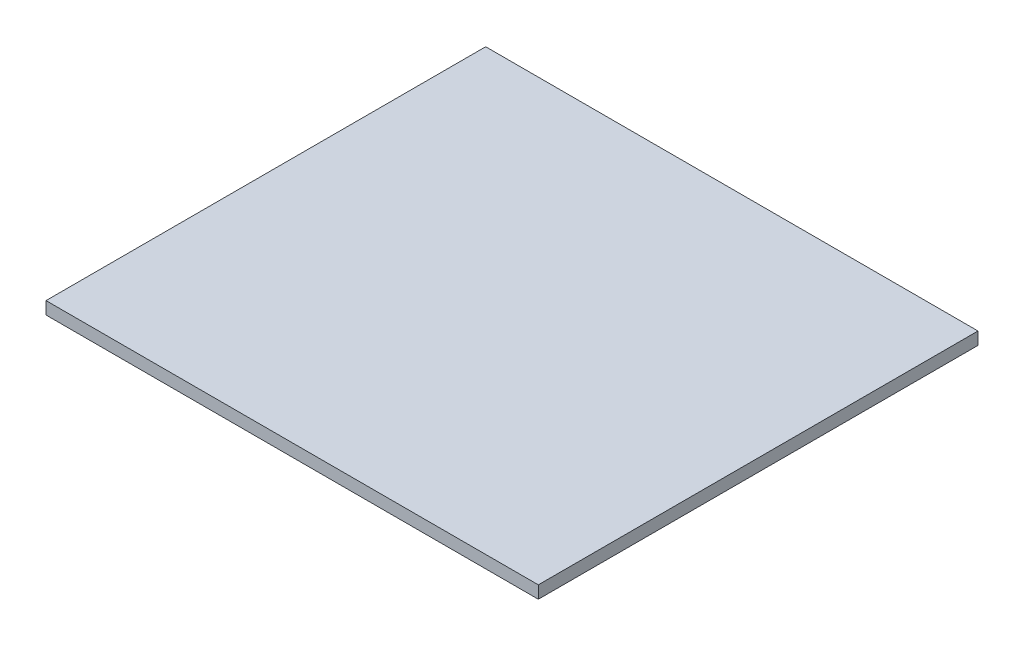
ISO-10303-21;
HEADER;
FILE_DESCRIPTION(('STEP AP214'),'2;1');
FILE_NAME('part.step','',(''),(''),'','','');
FILE_SCHEMA(('AUTOMOTIVE_DESIGN { 1 0 10303 214 1 1 1 1 }'));
ENDSEC;
DATA;
#1=APPLICATION_CONTEXT('core data for automotive mechanical design processes');
#2=APPLICATION_PROTOCOL_DEFINITION('international standard','automotive_design',2000,#1);
#3=PRODUCT_CONTEXT('',#1,'mechanical');
#4=PRODUCT('Part','Part','',(#3));
#5=PRODUCT_RELATED_PRODUCT_CATEGORY('part','',(#4));
#6=PRODUCT_DEFINITION_FORMATION('','',#4);
#7=PRODUCT_DEFINITION_CONTEXT('part definition',#1,'design');
#8=PRODUCT_DEFINITION('design','',#6,#7);
#9=PRODUCT_DEFINITION_SHAPE('','',#8);
#10=(LENGTH_UNIT() NAMED_UNIT(*) SI_UNIT(.MILLI.,.METRE.));
#11=(NAMED_UNIT(*) PLANE_ANGLE_UNIT() SI_UNIT($,.RADIAN.));
#12=(NAMED_UNIT(*) SI_UNIT($,.STERADIAN.) SOLID_ANGLE_UNIT());
#13=UNCERTAINTY_MEASURE_WITH_UNIT(LENGTH_MEASURE(1.E-05),#10,'distance_accuracy_value','');
#14=(GEOMETRIC_REPRESENTATION_CONTEXT(3) GLOBAL_UNCERTAINTY_ASSIGNED_CONTEXT((#13)) GLOBAL_UNIT_ASSIGNED_CONTEXT((#10,
#11,#12)) REPRESENTATION_CONTEXT('',''));
#15=CARTESIAN_POINT('',(0.,0.,0.));
#16=DIRECTION('',(0.,0.,1.));
#17=DIRECTION('',(1.,0.,0.));
#18=AXIS2_PLACEMENT_3D('',#15,#16,#17);
#19=CARTESIAN_POINT('',(0.,9.52500000000001,0.));
#20=DIRECTION('',(1.,0.,0.));
#21=DIRECTION('',(0.,0.,-1.));
#22=AXIS2_PLACEMENT_3D('',#19,#20,#21);
#23=PLANE('',#22);
#24=DIRECTION('',(0.,0.,1.));
#25=VECTOR('',#24,1.);
#26=CARTESIAN_POINT('',(0.,0.,0.));
#27=LINE('',#26,#25);
#28=CARTESIAN_POINT('',(0.,0.,-334.9));
#29=VERTEX_POINT('',#28);
#30=CARTESIAN_POINT('',(0.,0.,0.));
#31=VERTEX_POINT('',#30);
#32=EDGE_CURVE('E100',#29,#31,#27,.T.);
#33=ORIENTED_EDGE('',*,*,#32,.T.);
#34=DIRECTION('',(0.,-1.,0.));
#35=VECTOR('',#34,1.);
#36=CARTESIAN_POINT('',(0.,9.52500000000001,0.));
#37=LINE('',#36,#35);
#38=CARTESIAN_POINT('',(0.,9.52500000000001,0.));
#39=VERTEX_POINT('',#38);
#40=EDGE_CURVE('E11',#39,#31,#37,.T.);
#41=ORIENTED_EDGE('',*,*,#40,.F.);
#42=DIRECTION('',(0.,0.,1.));
#43=VECTOR('',#42,1.);
#44=CARTESIAN_POINT('',(0.,9.52500000000001,0.));
#45=LINE('',#44,#43);
#46=CARTESIAN_POINT('',(0.,9.52500000000003,-334.9));
#47=VERTEX_POINT('',#46);
#48=EDGE_CURVE('E88',#47,#39,#45,.T.);
#49=ORIENTED_EDGE('',*,*,#48,.F.);
#50=DIRECTION('',(0.,-1.,0.));
#51=VECTOR('',#50,1.);
#52=CARTESIAN_POINT('',(0.,9.52500000000003,-334.9));
#53=LINE('',#52,#51);
#54=EDGE_CURVE('E96',#47,#29,#53,.T.);
#55=ORIENTED_EDGE('',*,*,#54,.T.);
#56=EDGE_LOOP('',(#33,#41,#49,#55));
#57=FACE_BOUND('',#56,.T.);
#58=ADVANCED_FACE('F37',(#57),#23,.F.);
#59=CARTESIAN_POINT('',(0.,9.52500000000001,0.));
#60=DIRECTION('',(0.,0.,-1.));
#61=DIRECTION('',(-1.,0.,0.));
#62=AXIS2_PLACEMENT_3D('',#59,#60,#61);
#63=PLANE('',#62);
#64=DIRECTION('',(1.,0.,0.));
#65=VECTOR('',#64,1.);
#66=CARTESIAN_POINT('',(0.,0.,0.));
#67=LINE('',#66,#65);
#68=CARTESIAN_POINT('',(375.,0.,0.));
#69=VERTEX_POINT('',#68);
#70=EDGE_CURVE('E92',#31,#69,#67,.T.);
#71=ORIENTED_EDGE('',*,*,#70,.T.);
#72=DIRECTION('',(0.,-1.,0.));
#73=VECTOR('',#72,1.);
#74=CARTESIAN_POINT('',(375.,9.52499999999998,0.));
#75=LINE('',#74,#73);
#76=CARTESIAN_POINT('',(375.,9.52499999999998,0.));
#77=VERTEX_POINT('',#76);
#78=EDGE_CURVE('E45',#77,#69,#75,.T.);
#79=ORIENTED_EDGE('',*,*,#78,.F.);
#80=DIRECTION('',(1.,0.,0.));
#81=VECTOR('',#80,1.);
#82=CARTESIAN_POINT('',(0.,9.52500000000001,0.));
#83=LINE('',#82,#81);
#84=EDGE_CURVE('E83',#39,#77,#83,.T.);
#85=ORIENTED_EDGE('',*,*,#84,.F.);
#86=ORIENTED_EDGE('',*,*,#40,.T.);
#87=EDGE_LOOP('',(#71,#79,#85,#86));
#88=FACE_BOUND('',#87,.T.);
#89=ADVANCED_FACE('F91',(#88),#63,.F.);
#90=CARTESIAN_POINT('',(375.,9.52499999999998,0.));
#91=DIRECTION('',(-1.,0.,0.));
#92=DIRECTION('',(0.,0.,1.));
#93=AXIS2_PLACEMENT_3D('',#90,#91,#92);
#94=PLANE('',#93);
#95=DIRECTION('',(0.,0.,-1.));
#96=VECTOR('',#95,1.);
#97=CARTESIAN_POINT('',(375.,0.,0.));
#98=LINE('',#97,#96);
#99=CARTESIAN_POINT('',(375.,0.,-334.9));
#100=VERTEX_POINT('',#99);
#101=EDGE_CURVE('E70',#69,#100,#98,.T.);
#102=ORIENTED_EDGE('',*,*,#101,.T.);
#103=DIRECTION('',(0.,-1.,0.));
#104=VECTOR('',#103,1.);
#105=CARTESIAN_POINT('',(375.,9.52500000000001,-334.9));
#106=LINE('',#105,#104);
#107=CARTESIAN_POINT('',(375.,9.52500000000001,-334.9));
#108=VERTEX_POINT('',#107);
#109=EDGE_CURVE('E93',#108,#100,#106,.T.);
#110=ORIENTED_EDGE('',*,*,#109,.F.);
#111=DIRECTION('',(0.,0.,-1.));
#112=VECTOR('',#111,1.);
#113=CARTESIAN_POINT('',(375.,9.52499999999998,0.));
#114=LINE('',#113,#112);
#115=EDGE_CURVE('E86',#77,#108,#114,.T.);
#116=ORIENTED_EDGE('',*,*,#115,.F.);
#117=ORIENTED_EDGE('',*,*,#78,.T.);
#118=EDGE_LOOP('',(#102,#110,#116,#117));
#119=FACE_BOUND('',#118,.T.);
#120=ADVANCED_FACE('F94',(#119),#94,.F.);
#121=CARTESIAN_POINT('',(0.,9.52500000000003,-334.9));
#122=DIRECTION('',(0.,0.,1.));
#123=DIRECTION('',(1.,0.,0.));
#124=AXIS2_PLACEMENT_3D('',#121,#122,#123);
#125=PLANE('',#124);
#126=DIRECTION('',(-1.,0.,0.));
#127=VECTOR('',#126,1.);
#128=CARTESIAN_POINT('',(0.,0.,-334.9));
#129=LINE('',#128,#127);
#130=EDGE_CURVE('E76',#100,#29,#129,.T.);
#131=ORIENTED_EDGE('',*,*,#130,.T.);
#132=ORIENTED_EDGE('',*,*,#54,.F.);
#133=DIRECTION('',(-1.,0.,0.));
#134=VECTOR('',#133,1.);
#135=CARTESIAN_POINT('',(0.,9.52500000000003,-334.9));
#136=LINE('',#135,#134);
#137=EDGE_CURVE('E53',#108,#47,#136,.T.);
#138=ORIENTED_EDGE('',*,*,#137,.F.);
#139=ORIENTED_EDGE('',*,*,#109,.T.);
#140=EDGE_LOOP('',(#131,#132,#138,#139));
#141=FACE_BOUND('',#140,.T.);
#142=ADVANCED_FACE('F107',(#141),#125,.F.);
#143=CARTESIAN_POINT('',(0.,9.52500000000001,0.));
#144=DIRECTION('',(0.,-1.,0.));
#145=DIRECTION('',(0.,0.,-1.));
#146=AXIS2_PLACEMENT_3D('',#143,#144,#145);
#147=PLANE('',#146);
#148=ORIENTED_EDGE('',*,*,#48,.T.);
#149=ORIENTED_EDGE('',*,*,#84,.T.);
#150=ORIENTED_EDGE('',*,*,#115,.T.);
#151=ORIENTED_EDGE('',*,*,#137,.T.);
#152=EDGE_LOOP('',(#148,#149,#150,#151));
#153=FACE_BOUND('',#152,.T.);
#154=ADVANCED_FACE('F84',(#153),#147,.F.);
#155=CARTESIAN_POINT('',(0.,0.,0.));
#156=DIRECTION('',(0.,-1.,0.));
#157=DIRECTION('',(0.,0.,-1.));
#158=AXIS2_PLACEMENT_3D('',#155,#156,#157);
#159=PLANE('',#158);
#160=ORIENTED_EDGE('',*,*,#32,.F.);
#161=ORIENTED_EDGE('',*,*,#130,.F.);
#162=ORIENTED_EDGE('',*,*,#101,.F.);
#163=ORIENTED_EDGE('',*,*,#70,.F.);
#164=EDGE_LOOP('',(#160,#161,#162,#163));
#165=FACE_BOUND('',#164,.T.);
#166=ADVANCED_FACE('F110',(#165),#159,.T.);
#167=CLOSED_SHELL('',(#58,#89,#120,#142,#154,#166));
#168=MANIFOLD_SOLID_BREP('B2',#167);
#169=ADVANCED_BREP_SHAPE_REPRESENTATION('',(#18,#168),#14);
#170=SHAPE_DEFINITION_REPRESENTATION(#9,#169);
ENDSEC;
END-ISO-10303-21;
